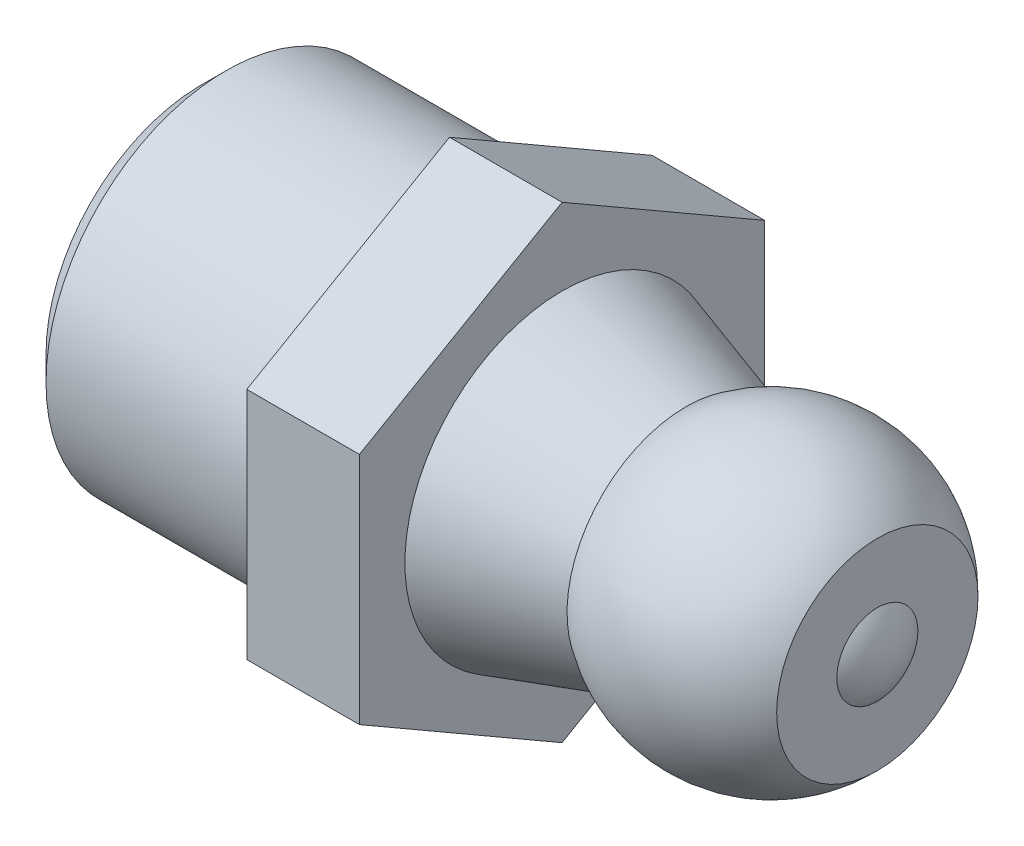
ISO-10303-21;
HEADER;
FILE_DESCRIPTION(('STEP AP214'),'2;1');
FILE_NAME('part.step','',(''),(''),'','','');
FILE_SCHEMA(('AUTOMOTIVE_DESIGN { 1 0 10303 214 1 1 1 1 }'));
ENDSEC;
DATA;
#1=APPLICATION_CONTEXT('core data for automotive mechanical design processes');
#2=APPLICATION_PROTOCOL_DEFINITION('international standard','automotive_design',2000,#1);
#3=PRODUCT_CONTEXT('',#1,'mechanical');
#4=PRODUCT('Part','Part','',(#3));
#5=PRODUCT_RELATED_PRODUCT_CATEGORY('part','',(#4));
#6=PRODUCT_DEFINITION_FORMATION('','',#4);
#7=PRODUCT_DEFINITION_CONTEXT('part definition',#1,'design');
#8=PRODUCT_DEFINITION('design','',#6,#7);
#9=PRODUCT_DEFINITION_SHAPE('','',#8);
#10=(LENGTH_UNIT() NAMED_UNIT(*) SI_UNIT(.MILLI.,.METRE.));
#11=(NAMED_UNIT(*) PLANE_ANGLE_UNIT() SI_UNIT($,.RADIAN.));
#12=(NAMED_UNIT(*) SI_UNIT($,.STERADIAN.) SOLID_ANGLE_UNIT());
#13=UNCERTAINTY_MEASURE_WITH_UNIT(LENGTH_MEASURE(1.E-05),#10,'distance_accuracy_value','');
#14=(GEOMETRIC_REPRESENTATION_CONTEXT(3) GLOBAL_UNCERTAINTY_ASSIGNED_CONTEXT((#13)) GLOBAL_UNIT_ASSIGNED_CONTEXT((#10,
#11,#12)) REPRESENTATION_CONTEXT('',''));
#15=CARTESIAN_POINT('',(0.,0.,0.));
#16=DIRECTION('',(0.,0.,1.));
#17=DIRECTION('',(1.,0.,0.));
#18=AXIS2_PLACEMENT_3D('',#15,#16,#17);
#19=CARTESIAN_POINT('',(8.3,0.,0.));
#20=DIRECTION('',(0.,0.,1.));
#21=DIRECTION('',(1.,0.,0.));
#22=AXIS2_PLACEMENT_3D('',#19,#20,#21);
#23=SPHERICAL_SURFACE('',#22,1.5);
#24=CARTESIAN_POINT('',(8.3,0.,0.));
#25=DIRECTION('',(1.,0.,0.));
#26=DIRECTION('',(0.,1.,0.));
#27=AXIS2_PLACEMENT_3D('',#24,#25,#26);
#28=SPHERICAL_SURFACE('',#27,1.5);
#29=CARTESIAN_POINT('',(9.5,0.,0.));
#30=DIRECTION('',(1.,0.,0.));
#31=DIRECTION('',(0.,1.,0.));
#32=AXIS2_PLACEMENT_3D('',#29,#30,#31);
#33=CIRCLE('',#32,0.9);
#34=CARTESIAN_POINT('',(9.5,0.9,0.));
#35=VERTEX_POINT('',#34);
#36=EDGE_CURVE('E163',#35,#35,#33,.T.);
#37=ORIENTED_EDGE('',*,*,#36,.T.);
#38=EDGE_LOOP('',(#37));
#39=FACE_BOUND('',#38,.T.);
#40=ADVANCED_FACE('F43',(#39),#28,.T.);
#41=CARTESIAN_POINT('',(9.5,1.5,0.));
#42=DIRECTION('',(1.,0.,0.));
#43=DIRECTION('',(0.,1.,0.));
#44=AXIS2_PLACEMENT_3D('',#41,#42,#43);
#45=PLANE('',#44);
#46=ORIENTED_EDGE('',*,*,#36,.F.);
#47=EDGE_LOOP('',(#46));
#48=FACE_BOUND('',#47,.T.);
#49=CARTESIAN_POINT('',(9.5,0.,0.));
#50=DIRECTION('',(1.,0.,0.));
#51=DIRECTION('',(0.,0.,-1.));
#52=AXIS2_PLACEMENT_3D('',#49,#50,#51);
#53=CIRCLE('',#52,2.23516392300743);
#54=CARTESIAN_POINT('',(9.5,0.,-2.23516392300743));
#55=VERTEX_POINT('',#54);
#56=EDGE_CURVE('E257',#55,#55,#53,.F.);
#57=ORIENTED_EDGE('',*,*,#56,.F.);
#58=EDGE_LOOP('',(#57));
#59=FACE_BOUND('',#58,.T.);
#60=ADVANCED_FACE('F286',(#48,#59),#45,.T.);
#61=CARTESIAN_POINT('',(7.14260971425139,0.,0.));
#62=DIRECTION('',(1.,0.,0.));
#63=DIRECTION('',(0.,0.,1.));
#64=AXIS2_PLACEMENT_3D('',#61,#62,#63);
#65=DEGENERATE_TOROIDAL_SURFACE('',#64,0.00206897516345217,3.25,.F.);
#66=CARTESIAN_POINT('',(5.25,0.,0.));
#67=DIRECTION('',(1.,0.,0.));
#68=DIRECTION('',(0.,1.,0.));
#69=AXIS2_PLACEMENT_3D('',#66,#67,#68);
#70=CIRCLE('',#69,2.64);
#71=CARTESIAN_POINT('',(5.25,2.64,0.));
#72=VERTEX_POINT('',#71);
#73=EDGE_CURVE('E158',#72,#72,#70,.T.);
#74=ORIENTED_EDGE('',*,*,#73,.T.);
#75=EDGE_LOOP('',(#74));
#76=FACE_BOUND('',#75,.T.);
#77=ORIENTED_EDGE('',*,*,#56,.T.);
#78=EDGE_LOOP('',(#77));
#79=FACE_BOUND('',#78,.T.);
#80=ADVANCED_FACE('F291',(#76,#79),#65,.F.);
#81=CARTESIAN_POINT('',(3.875,0.,0.));
#82=DIRECTION('',(-1.,0.,0.));
#83=DIRECTION('',(0.,1.,0.));
#84=AXIS2_PLACEMENT_3D('',#81,#82,#83);
#85=CONICAL_SURFACE('',#84,3.065,0.29977607009998);
#86=CARTESIAN_POINT('',(2.5,0.,0.));
#87=DIRECTION('',(-1.,0.,0.));
#88=DIRECTION('',(0.,-1.,0.));
#89=AXIS2_PLACEMENT_3D('',#86,#87,#88);
#90=CIRCLE('',#89,3.49);
#91=CARTESIAN_POINT('',(2.5,-3.49,0.));
#92=VERTEX_POINT('',#91);
#93=EDGE_CURVE('E149',#92,#92,#90,.F.);
#94=ORIENTED_EDGE('',*,*,#93,.T.);
#95=EDGE_LOOP('',(#94));
#96=FACE_BOUND('',#95,.T.);
#97=ORIENTED_EDGE('',*,*,#73,.F.);
#98=EDGE_LOOP('',(#97));
#99=FACE_BOUND('',#98,.T.);
#100=ADVANCED_FACE('F282',(#96,#99),#85,.T.);
#101=CARTESIAN_POINT('',(0.,2.59807621135332,-4.5));
#102=DIRECTION('',(0.,0.866025403784439,-0.5));
#103=DIRECTION('',(0.,0.5,0.866025403784439));
#104=AXIS2_PLACEMENT_3D('',#101,#102,#103);
#105=PLANE('',#104);
#106=DIRECTION('',(0.,0.5,0.866025403784439));
#107=VECTOR('',#106,1.);
#108=CARTESIAN_POINT('',(2.5,2.59807621135332,-4.5));
#109=LINE('',#108,#107);
#110=CARTESIAN_POINT('',(2.5,2.59807621135332,-4.5));
#111=VERTEX_POINT('',#110);
#112=CARTESIAN_POINT('',(2.5,5.19615242270663,0.));
#113=VERTEX_POINT('',#112);
#114=EDGE_CURVE('E132',#111,#113,#109,.T.);
#115=ORIENTED_EDGE('',*,*,#114,.F.);
#116=DIRECTION('',(1.,0.,0.));
#117=VECTOR('',#116,1.);
#118=CARTESIAN_POINT('',(0.,2.59807621135332,-4.5));
#119=LINE('',#118,#117);
#120=CARTESIAN_POINT('',(0.,2.59807621135332,-4.5));
#121=VERTEX_POINT('',#120);
#122=EDGE_CURVE('E61',#121,#111,#119,.T.);
#123=ORIENTED_EDGE('',*,*,#122,.F.);
#124=DIRECTION('',(0.,0.5,0.866025403784439));
#125=VECTOR('',#124,1.);
#126=CARTESIAN_POINT('',(0.,2.59807621135332,-4.5));
#127=LINE('',#126,#125);
#128=CARTESIAN_POINT('',(0.,5.19615242270663,0.));
#129=VERTEX_POINT('',#128);
#130=EDGE_CURVE('E147',#121,#129,#127,.T.);
#131=ORIENTED_EDGE('',*,*,#130,.T.);
#132=DIRECTION('',(1.,0.,0.));
#133=VECTOR('',#132,1.);
#134=CARTESIAN_POINT('',(0.,5.19615242270663,0.));
#135=LINE('',#134,#133);
#136=EDGE_CURVE('E96',#129,#113,#135,.T.);
#137=ORIENTED_EDGE('',*,*,#136,.T.);
#138=EDGE_LOOP('',(#115,#123,#131,#137));
#139=FACE_BOUND('',#138,.T.);
#140=ADVANCED_FACE('F271',(#139),#105,.T.);
#141=CARTESIAN_POINT('',(0.,-2.59807621135332,-4.5));
#142=DIRECTION('',(0.,0.,-1.));
#143=DIRECTION('',(-1.,0.,0.));
#144=AXIS2_PLACEMENT_3D('',#141,#142,#143);
#145=PLANE('',#144);
#146=DIRECTION('',(0.,1.,0.));
#147=VECTOR('',#146,1.);
#148=CARTESIAN_POINT('',(2.5,-2.59807621135332,-4.5));
#149=LINE('',#148,#147);
#150=CARTESIAN_POINT('',(2.5,-2.59807621135332,-4.5));
#151=VERTEX_POINT('',#150);
#152=EDGE_CURVE('E144',#151,#111,#149,.T.);
#153=ORIENTED_EDGE('',*,*,#152,.F.);
#154=DIRECTION('',(1.,0.,0.));
#155=VECTOR('',#154,1.);
#156=CARTESIAN_POINT('',(0.,-2.59807621135332,-4.5));
#157=LINE('',#156,#155);
#158=CARTESIAN_POINT('',(0.,-2.59807621135332,-4.5));
#159=VERTEX_POINT('',#158);
#160=EDGE_CURVE('E84',#159,#151,#157,.T.);
#161=ORIENTED_EDGE('',*,*,#160,.F.);
#162=DIRECTION('',(0.,1.,0.));
#163=VECTOR('',#162,1.);
#164=CARTESIAN_POINT('',(0.,-2.59807621135332,-4.5));
#165=LINE('',#164,#163);
#166=EDGE_CURVE('E122',#159,#121,#165,.T.);
#167=ORIENTED_EDGE('',*,*,#166,.T.);
#168=ORIENTED_EDGE('',*,*,#122,.T.);
#169=EDGE_LOOP('',(#153,#161,#167,#168));
#170=FACE_BOUND('',#169,.T.);
#171=ADVANCED_FACE('F274',(#170),#145,.T.);
#172=CARTESIAN_POINT('',(0.,-5.19615242270663,0.));
#173=DIRECTION('',(0.,-0.866025403784439,-0.5));
#174=DIRECTION('',(0.,0.5,-0.866025403784439));
#175=AXIS2_PLACEMENT_3D('',#172,#173,#174);
#176=PLANE('',#175);
#177=DIRECTION('',(0.,0.5,-0.866025403784439));
#178=VECTOR('',#177,1.);
#179=CARTESIAN_POINT('',(2.5,-5.19615242270663,0.));
#180=LINE('',#179,#178);
#181=CARTESIAN_POINT('',(2.5,-5.19615242270663,0.));
#182=VERTEX_POINT('',#181);
#183=EDGE_CURVE('E109',#182,#151,#180,.T.);
#184=ORIENTED_EDGE('',*,*,#183,.F.);
#185=DIRECTION('',(1.,0.,0.));
#186=VECTOR('',#185,1.);
#187=CARTESIAN_POINT('',(0.,-5.19615242270663,0.));
#188=LINE('',#187,#186);
#189=CARTESIAN_POINT('',(0.,-5.19615242270663,0.));
#190=VERTEX_POINT('',#189);
#191=EDGE_CURVE('E104',#190,#182,#188,.T.);
#192=ORIENTED_EDGE('',*,*,#191,.F.);
#193=DIRECTION('',(0.,0.5,-0.866025403784439));
#194=VECTOR('',#193,1.);
#195=CARTESIAN_POINT('',(0.,-5.19615242270663,0.));
#196=LINE('',#195,#194);
#197=EDGE_CURVE('E107',#190,#159,#196,.T.);
#198=ORIENTED_EDGE('',*,*,#197,.T.);
#199=ORIENTED_EDGE('',*,*,#160,.T.);
#200=EDGE_LOOP('',(#184,#192,#198,#199));
#201=FACE_BOUND('',#200,.T.);
#202=ADVANCED_FACE('F106',(#201),#176,.T.);
#203=CARTESIAN_POINT('',(0.,-2.59807621135332,4.5));
#204=DIRECTION('',(0.,-0.866025403784439,0.5));
#205=DIRECTION('',(0.,-0.5,-0.866025403784439));
#206=AXIS2_PLACEMENT_3D('',#203,#204,#205);
#207=PLANE('',#206);
#208=DIRECTION('',(0.,-0.5,-0.866025403784439));
#209=VECTOR('',#208,1.);
#210=CARTESIAN_POINT('',(2.5,-2.59807621135332,4.5));
#211=LINE('',#210,#209);
#212=CARTESIAN_POINT('',(2.5,-2.59807621135332,4.5));
#213=VERTEX_POINT('',#212);
#214=EDGE_CURVE('E141',#213,#182,#211,.T.);
#215=ORIENTED_EDGE('',*,*,#214,.F.);
#216=DIRECTION('',(1.,0.,0.));
#217=VECTOR('',#216,1.);
#218=CARTESIAN_POINT('',(0.,-2.59807621135332,4.5));
#219=LINE('',#218,#217);
#220=CARTESIAN_POINT('',(0.,-2.59807621135332,4.5));
#221=VERTEX_POINT('',#220);
#222=EDGE_CURVE('E114',#221,#213,#219,.T.);
#223=ORIENTED_EDGE('',*,*,#222,.F.);
#224=DIRECTION('',(0.,-0.5,-0.866025403784439));
#225=VECTOR('',#224,1.);
#226=CARTESIAN_POINT('',(0.,-2.59807621135332,4.5));
#227=LINE('',#226,#225);
#228=EDGE_CURVE('E120',#221,#190,#227,.T.);
#229=ORIENTED_EDGE('',*,*,#228,.T.);
#230=ORIENTED_EDGE('',*,*,#191,.T.);
#231=EDGE_LOOP('',(#215,#223,#229,#230));
#232=FACE_BOUND('',#231,.T.);
#233=ADVANCED_FACE('F124',(#232),#207,.T.);
#234=CARTESIAN_POINT('',(0.,2.59807621135332,4.5));
#235=DIRECTION('',(0.,0.,1.));
#236=DIRECTION('',(1.,0.,0.));
#237=AXIS2_PLACEMENT_3D('',#234,#235,#236);
#238=PLANE('',#237);
#239=DIRECTION('',(0.,-1.,0.));
#240=VECTOR('',#239,1.);
#241=CARTESIAN_POINT('',(2.5,2.59807621135332,4.5));
#242=LINE('',#241,#240);
#243=CARTESIAN_POINT('',(2.5,2.59807621135332,4.5));
#244=VERTEX_POINT('',#243);
#245=EDGE_CURVE('E138',#244,#213,#242,.T.);
#246=ORIENTED_EDGE('',*,*,#245,.F.);
#247=DIRECTION('',(1.,0.,0.));
#248=VECTOR('',#247,1.);
#249=CARTESIAN_POINT('',(0.,2.59807621135332,4.5));
#250=LINE('',#249,#248);
#251=CARTESIAN_POINT('',(0.,2.59807621135332,4.5));
#252=VERTEX_POINT('',#251);
#253=EDGE_CURVE('E152',#252,#244,#250,.T.);
#254=ORIENTED_EDGE('',*,*,#253,.F.);
#255=DIRECTION('',(0.,-1.,0.));
#256=VECTOR('',#255,1.);
#257=CARTESIAN_POINT('',(0.,2.59807621135332,4.5));
#258=LINE('',#257,#256);
#259=EDGE_CURVE('E125',#252,#221,#258,.T.);
#260=ORIENTED_EDGE('',*,*,#259,.T.);
#261=ORIENTED_EDGE('',*,*,#222,.T.);
#262=EDGE_LOOP('',(#246,#254,#260,#261));
#263=FACE_BOUND('',#262,.T.);
#264=ADVANCED_FACE('F303',(#263),#238,.T.);
#265=CARTESIAN_POINT('',(0.,5.19615242270663,0.));
#266=DIRECTION('',(0.,0.866025403784439,0.499999999999999));
#267=DIRECTION('',(0.,-0.499999999999999,0.866025403784439));
#268=AXIS2_PLACEMENT_3D('',#265,#266,#267);
#269=PLANE('',#268);
#270=DIRECTION('',(0.,-0.499999999999999,0.866025403784439));
#271=VECTOR('',#270,1.);
#272=CARTESIAN_POINT('',(2.5,5.19615242270663,0.));
#273=LINE('',#272,#271);
#274=EDGE_CURVE('E135',#113,#244,#273,.T.);
#275=ORIENTED_EDGE('',*,*,#274,.F.);
#276=ORIENTED_EDGE('',*,*,#136,.F.);
#277=DIRECTION('',(0.,-0.499999999999999,0.866025403784439));
#278=VECTOR('',#277,1.);
#279=CARTESIAN_POINT('',(0.,5.19615242270663,0.));
#280=LINE('',#279,#278);
#281=EDGE_CURVE('E127',#129,#252,#280,.T.);
#282=ORIENTED_EDGE('',*,*,#281,.T.);
#283=ORIENTED_EDGE('',*,*,#253,.T.);
#284=EDGE_LOOP('',(#275,#276,#282,#283));
#285=FACE_BOUND('',#284,.T.);
#286=ADVANCED_FACE('F269',(#285),#269,.T.);
#287=CARTESIAN_POINT('',(0.,0.,0.));
#288=DIRECTION('',(1.,0.,0.));
#289=DIRECTION('',(0.,0.,-1.));
#290=AXIS2_PLACEMENT_3D('',#287,#288,#289);
#291=PLANE('',#290);
#292=CARTESIAN_POINT('',(0.,0.,0.));
#293=DIRECTION('',(-1.,0.,0.));
#294=DIRECTION('',(0.,0.,1.));
#295=AXIS2_PLACEMENT_3D('',#292,#293,#294);
#296=CIRCLE('',#295,4.);
#297=CARTESIAN_POINT('',(0.,0.,4.));
#298=VERTEX_POINT('',#297);
#299=EDGE_CURVE('E260',#298,#298,#296,.T.);
#300=ORIENTED_EDGE('',*,*,#299,.F.);
#301=EDGE_LOOP('',(#300));
#302=FACE_BOUND('',#301,.T.);
#303=ORIENTED_EDGE('',*,*,#130,.F.);
#304=ORIENTED_EDGE('',*,*,#166,.F.);
#305=ORIENTED_EDGE('',*,*,#197,.F.);
#306=ORIENTED_EDGE('',*,*,#228,.F.);
#307=ORIENTED_EDGE('',*,*,#259,.F.);
#308=ORIENTED_EDGE('',*,*,#281,.F.);
#309=EDGE_LOOP('',(#303,#304,#305,#306,#307,#308));
#310=FACE_BOUND('',#309,.T.);
#311=ADVANCED_FACE('F118',(#302,#310),#291,.F.);
#312=CARTESIAN_POINT('',(2.5,0.,0.));
#313=DIRECTION('',(1.,0.,0.));
#314=DIRECTION('',(0.,0.,-1.));
#315=AXIS2_PLACEMENT_3D('',#312,#313,#314);
#316=PLANE('',#315);
#317=ORIENTED_EDGE('',*,*,#93,.F.);
#318=EDGE_LOOP('',(#317));
#319=FACE_BOUND('',#318,.T.);
#320=ORIENTED_EDGE('',*,*,#114,.T.);
#321=ORIENTED_EDGE('',*,*,#274,.T.);
#322=ORIENTED_EDGE('',*,*,#245,.T.);
#323=ORIENTED_EDGE('',*,*,#214,.T.);
#324=ORIENTED_EDGE('',*,*,#183,.T.);
#325=ORIENTED_EDGE('',*,*,#152,.T.);
#326=EDGE_LOOP('',(#320,#321,#322,#323,#324,#325));
#327=FACE_BOUND('',#326,.T.);
#328=ADVANCED_FACE('F273',(#319,#327),#316,.T.);
#329=CARTESIAN_POINT('',(0.,0.,0.));
#330=DIRECTION('',(-1.,0.,0.));
#331=DIRECTION('',(0.,0.,1.));
#332=AXIS2_PLACEMENT_3D('',#329,#330,#331);
#333=CYLINDRICAL_SURFACE('',#332,4.);
#334=CARTESIAN_POINT('',(-4.958734,0.,0.));
#335=DIRECTION('',(-1.,0.,0.));
#336=DIRECTION('',(0.,0.,1.));
#337=AXIS2_PLACEMENT_3D('',#334,#335,#336);
#338=CIRCLE('',#337,4.);
#339=CARTESIAN_POINT('',(-4.958734,0.,4.));
#340=VERTEX_POINT('',#339);
#341=EDGE_CURVE('E12',#340,#340,#338,.F.);
#342=ORIENTED_EDGE('',*,*,#341,.T.);
#343=EDGE_LOOP('',(#342));
#344=FACE_BOUND('',#343,.T.);
#345=ORIENTED_EDGE('',*,*,#299,.T.);
#346=EDGE_LOOP('',(#345));
#347=FACE_BOUND('',#346,.T.);
#348=ADVANCED_FACE('F334',(#344,#347),#333,.T.);
#349=CARTESIAN_POINT('',(-5.5,0.,0.));
#350=DIRECTION('',(-1.,0.,0.));
#351=DIRECTION('',(0.,0.,1.));
#352=AXIS2_PLACEMENT_3D('',#349,#350,#351);
#353=PLANE('',#352);
#354=CARTESIAN_POINT('',(-5.5,0.,0.));
#355=DIRECTION('',(-1.,0.,0.));
#356=DIRECTION('',(0.,0.,1.));
#357=AXIS2_PLACEMENT_3D('',#354,#355,#356);
#358=CIRCLE('',#357,3.458734);
#359=CARTESIAN_POINT('',(-5.5,0.,3.458734));
#360=VERTEX_POINT('',#359);
#361=EDGE_CURVE('E53',#360,#360,#358,.T.);
#362=ORIENTED_EDGE('',*,*,#361,.T.);
#363=EDGE_LOOP('',(#362));
#364=FACE_BOUND('',#363,.T.);
#365=ADVANCED_FACE('F340',(#364),#353,.T.);
#366=CARTESIAN_POINT('',(-5.5,0.,0.));
#367=DIRECTION('',(1.,0.,0.));
#368=DIRECTION('',(0.,0.,-1.));
#369=AXIS2_PLACEMENT_3D('',#366,#367,#368);
#370=CONICAL_SURFACE('',#369,3.458734,0.785398163397443);
#371=ORIENTED_EDGE('',*,*,#341,.F.);
#372=EDGE_LOOP('',(#371));
#373=FACE_BOUND('',#372,.T.);
#374=ORIENTED_EDGE('',*,*,#361,.F.);
#375=EDGE_LOOP('',(#374));
#376=FACE_BOUND('',#375,.T.);
#377=ADVANCED_FACE('F46',(#373,#376),#370,.T.);
#378=CLOSED_SHELL('',(#40,#60,#80,#100,#140,#171,#202,#233,#264,#286,#311,#328,#348,#365,#377));
#379=MANIFOLD_SOLID_BREP('B2',#378);
#380=ADVANCED_BREP_SHAPE_REPRESENTATION('',(#18,#379),#14);
#381=SHAPE_DEFINITION_REPRESENTATION(#9,#380);
ENDSEC;
END-ISO-10303-21;
